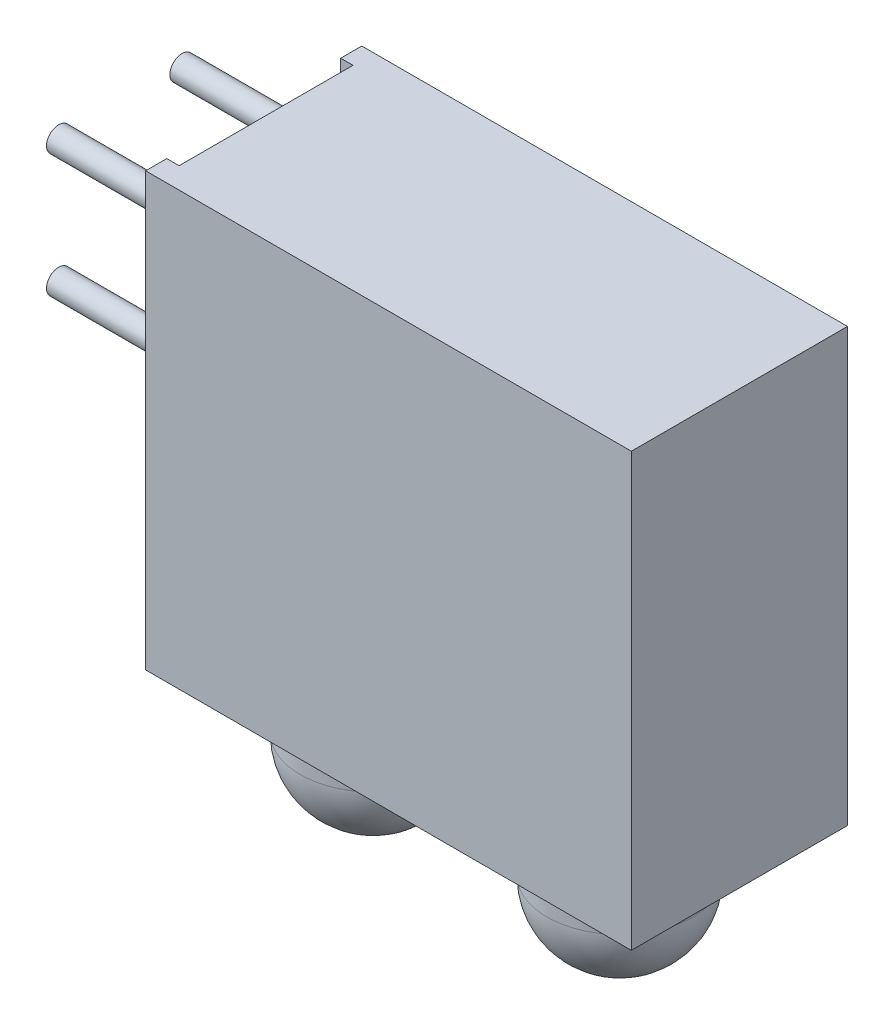
ISO-10303-21;
HEADER;
FILE_DESCRIPTION(('STEP AP214'),'2;1');
FILE_NAME('part.step','',(''),(''),'','','');
FILE_SCHEMA(('AUTOMOTIVE_DESIGN { 1 0 10303 214 1 1 1 1 }'));
ENDSEC;
DATA;
#1=APPLICATION_CONTEXT('core data for automotive mechanical design processes');
#2=APPLICATION_PROTOCOL_DEFINITION('international standard','automotive_design',2000,#1);
#3=PRODUCT_CONTEXT('',#1,'mechanical');
#4=PRODUCT('Part','Part','',(#3));
#5=PRODUCT_RELATED_PRODUCT_CATEGORY('part','',(#4));
#6=PRODUCT_DEFINITION_FORMATION('','',#4);
#7=PRODUCT_DEFINITION_CONTEXT('part definition',#1,'design');
#8=PRODUCT_DEFINITION('design','',#6,#7);
#9=PRODUCT_DEFINITION_SHAPE('','',#8);
#10=(LENGTH_UNIT() NAMED_UNIT(*) SI_UNIT(.MILLI.,.METRE.));
#11=(NAMED_UNIT(*) PLANE_ANGLE_UNIT() SI_UNIT($,.RADIAN.));
#12=(NAMED_UNIT(*) SI_UNIT($,.STERADIAN.) SOLID_ANGLE_UNIT());
#13=UNCERTAINTY_MEASURE_WITH_UNIT(LENGTH_MEASURE(1.E-05),#10,'distance_accuracy_value','');
#14=(GEOMETRIC_REPRESENTATION_CONTEXT(3) GLOBAL_UNCERTAINTY_ASSIGNED_CONTEXT((#13)) GLOBAL_UNIT_ASSIGNED_CONTEXT((#10,
#11,#12)) REPRESENTATION_CONTEXT('',''));
#15=CARTESIAN_POINT('',(0.,0.,0.));
#16=DIRECTION('',(0.,0.,1.));
#17=DIRECTION('',(1.,0.,0.));
#18=AXIS2_PLACEMENT_3D('',#15,#16,#17);
#19=CARTESIAN_POINT('',(0.,8.9,2.225));
#20=DIRECTION('',(1.,0.,0.));
#21=DIRECTION('',(0.,0.,-1.));
#22=AXIS2_PLACEMENT_3D('',#19,#20,#21);
#23=PLANE('',#22);
#24=DIRECTION('',(0.,0.,1.));
#25=VECTOR('',#24,1.);
#26=CARTESIAN_POINT('',(0.,8.9,2.225));
#27=LINE('',#26,#25);
#28=CARTESIAN_POINT('',(0.,8.9,1.79));
#29=VERTEX_POINT('',#28);
#30=CARTESIAN_POINT('',(0.,8.9,2.225));
#31=VERTEX_POINT('',#30);
#32=EDGE_CURVE('E93',#29,#31,#27,.T.);
#33=ORIENTED_EDGE('',*,*,#32,.F.);
#34=DIRECTION('',(0.,-1.,0.));
#35=VECTOR('',#34,1.);
#36=CARTESIAN_POINT('',(0.,8.901,1.79));
#37=LINE('',#36,#35);
#38=CARTESIAN_POINT('',(0.,0.,1.79));
#39=VERTEX_POINT('',#38);
#40=EDGE_CURVE('E122',#29,#39,#37,.T.);
#41=ORIENTED_EDGE('',*,*,#40,.T.);
#42=DIRECTION('',(0.,0.,1.));
#43=VECTOR('',#42,1.);
#44=CARTESIAN_POINT('',(0.,0.,2.225));
#45=LINE('',#44,#43);
#46=CARTESIAN_POINT('',(0.,0.,2.225));
#47=VERTEX_POINT('',#46);
#48=EDGE_CURVE('E155',#39,#47,#45,.T.);
#49=ORIENTED_EDGE('',*,*,#48,.T.);
#50=DIRECTION('',(0.,-1.,0.));
#51=VECTOR('',#50,1.);
#52=CARTESIAN_POINT('',(0.,8.9,2.225));
#53=LINE('',#52,#51);
#54=EDGE_CURVE('E172',#31,#47,#53,.T.);
#55=ORIENTED_EDGE('',*,*,#54,.F.);
#56=EDGE_LOOP('',(#33,#41,#49,#55));
#57=FACE_BOUND('',#56,.T.);
#58=ADVANCED_FACE('F40',(#57),#23,.F.);
#59=CARTESIAN_POINT('',(0.,0.,-2.225));
#60=VERTEX_POINT('',#59);
#61=CARTESIAN_POINT('',(0.,0.,-1.79));
#62=VERTEX_POINT('',#61);
#63=EDGE_CURVE('E130',#60,#62,#45,.T.);
#64=ORIENTED_EDGE('',*,*,#63,.T.);
#65=DIRECTION('',(0.,-1.,0.));
#66=VECTOR('',#65,1.);
#67=CARTESIAN_POINT('',(0.,8.901,-1.79));
#68=LINE('',#67,#66);
#69=CARTESIAN_POINT('',(0.,8.9,-1.79));
#70=VERTEX_POINT('',#69);
#71=EDGE_CURVE('E56',#70,#62,#68,.T.);
#72=ORIENTED_EDGE('',*,*,#71,.F.);
#73=CARTESIAN_POINT('',(0.,8.9,-2.225));
#74=VERTEX_POINT('',#73);
#75=EDGE_CURVE('E128',#74,#70,#27,.T.);
#76=ORIENTED_EDGE('',*,*,#75,.F.);
#77=DIRECTION('',(0.,-1.,0.));
#78=VECTOR('',#77,1.);
#79=CARTESIAN_POINT('',(0.,8.9,-2.225));
#80=LINE('',#79,#78);
#81=EDGE_CURVE('E151',#74,#60,#80,.T.);
#82=ORIENTED_EDGE('',*,*,#81,.T.);
#83=EDGE_LOOP('',(#64,#72,#76,#82));
#84=FACE_BOUND('',#83,.T.);
#85=ADVANCED_FACE('F127',(#84),#23,.F.);
#86=CARTESIAN_POINT('',(0.,8.9,2.225));
#87=DIRECTION('',(0.,0.,-1.));
#88=DIRECTION('',(-1.,0.,0.));
#89=AXIS2_PLACEMENT_3D('',#86,#87,#88);
#90=PLANE('',#89);
#91=DIRECTION('',(1.,0.,0.));
#92=VECTOR('',#91,1.);
#93=CARTESIAN_POINT('',(0.,0.,2.225));
#94=LINE('',#93,#92);
#95=CARTESIAN_POINT('',(10.,0.,2.225));
#96=VERTEX_POINT('',#95);
#97=EDGE_CURVE('E154',#47,#96,#94,.T.);
#98=ORIENTED_EDGE('',*,*,#97,.T.);
#99=DIRECTION('',(0.,-1.,0.));
#100=VECTOR('',#99,1.);
#101=CARTESIAN_POINT('',(10.,8.9,2.225));
#102=LINE('',#101,#100);
#103=CARTESIAN_POINT('',(10.,8.9,2.225));
#104=VERTEX_POINT('',#103);
#105=EDGE_CURVE('E168',#104,#96,#102,.T.);
#106=ORIENTED_EDGE('',*,*,#105,.F.);
#107=DIRECTION('',(1.,0.,0.));
#108=VECTOR('',#107,1.);
#109=CARTESIAN_POINT('',(0.,8.9,2.225));
#110=LINE('',#109,#108);
#111=EDGE_CURVE('E136',#31,#104,#110,.T.);
#112=ORIENTED_EDGE('',*,*,#111,.F.);
#113=ORIENTED_EDGE('',*,*,#54,.T.);
#114=EDGE_LOOP('',(#98,#106,#112,#113));
#115=FACE_BOUND('',#114,.T.);
#116=ADVANCED_FACE('F287',(#115),#90,.F.);
#117=CARTESIAN_POINT('',(10.,8.9,2.225));
#118=DIRECTION('',(-1.,0.,0.));
#119=DIRECTION('',(0.,0.,1.));
#120=AXIS2_PLACEMENT_3D('',#117,#118,#119);
#121=PLANE('',#120);
#122=DIRECTION('',(0.,0.,-1.));
#123=VECTOR('',#122,1.);
#124=CARTESIAN_POINT('',(10.,0.,2.225));
#125=LINE('',#124,#123);
#126=CARTESIAN_POINT('',(10.,0.,-2.225));
#127=VERTEX_POINT('',#126);
#128=EDGE_CURVE('E158',#96,#127,#125,.T.);
#129=ORIENTED_EDGE('',*,*,#128,.T.);
#130=DIRECTION('',(0.,-1.,0.));
#131=VECTOR('',#130,1.);
#132=CARTESIAN_POINT('',(10.,8.9,-2.225));
#133=LINE('',#132,#131);
#134=CARTESIAN_POINT('',(10.,8.9,-2.225));
#135=VERTEX_POINT('',#134);
#136=EDGE_CURVE('E165',#135,#127,#133,.T.);
#137=ORIENTED_EDGE('',*,*,#136,.F.);
#138=DIRECTION('',(0.,0.,-1.));
#139=VECTOR('',#138,1.);
#140=CARTESIAN_POINT('',(10.,8.9,2.225));
#141=LINE('',#140,#139);
#142=EDGE_CURVE('E140',#104,#135,#141,.T.);
#143=ORIENTED_EDGE('',*,*,#142,.F.);
#144=ORIENTED_EDGE('',*,*,#105,.T.);
#145=EDGE_LOOP('',(#129,#137,#143,#144));
#146=FACE_BOUND('',#145,.T.);
#147=ADVANCED_FACE('F310',(#146),#121,.F.);
#148=CARTESIAN_POINT('',(0.,8.9,-2.225));
#149=DIRECTION('',(0.,0.,1.));
#150=DIRECTION('',(1.,0.,0.));
#151=AXIS2_PLACEMENT_3D('',#148,#149,#150);
#152=PLANE('',#151);
#153=DIRECTION('',(-1.,0.,0.));
#154=VECTOR('',#153,1.);
#155=CARTESIAN_POINT('',(0.,0.,-2.225));
#156=LINE('',#155,#154);
#157=EDGE_CURVE('E86',#127,#60,#156,.T.);
#158=ORIENTED_EDGE('',*,*,#157,.T.);
#159=ORIENTED_EDGE('',*,*,#81,.F.);
#160=DIRECTION('',(-1.,0.,0.));
#161=VECTOR('',#160,1.);
#162=CARTESIAN_POINT('',(0.,8.9,-2.225));
#163=LINE('',#162,#161);
#164=EDGE_CURVE('E65',#135,#74,#163,.T.);
#165=ORIENTED_EDGE('',*,*,#164,.F.);
#166=ORIENTED_EDGE('',*,*,#136,.T.);
#167=EDGE_LOOP('',(#158,#159,#165,#166));
#168=FACE_BOUND('',#167,.T.);
#169=ADVANCED_FACE('F307',(#168),#152,.F.);
#170=CARTESIAN_POINT('',(0.,8.9,0.));
#171=DIRECTION('',(0.,-1.,0.));
#172=DIRECTION('',(0.,0.,-1.));
#173=AXIS2_PLACEMENT_3D('',#170,#171,#172);
#174=PLANE('',#173);
#175=DIRECTION('',(0.,0.,-1.));
#176=VECTOR('',#175,1.);
#177=CARTESIAN_POINT('',(0.254,8.9,1.79));
#178=LINE('',#177,#176);
#179=CARTESIAN_POINT('',(0.254,8.9,1.79));
#180=VERTEX_POINT('',#179);
#181=CARTESIAN_POINT('',(0.254,8.9,-1.79));
#182=VERTEX_POINT('',#181);
#183=EDGE_CURVE('E207',#180,#182,#178,.T.);
#184=ORIENTED_EDGE('',*,*,#183,.F.);
#185=DIRECTION('',(1.,0.,0.));
#186=VECTOR('',#185,1.);
#187=CARTESIAN_POINT('',(0.,8.9,1.79));
#188=LINE('',#187,#186);
#189=EDGE_CURVE('E211',#29,#180,#188,.T.);
#190=ORIENTED_EDGE('',*,*,#189,.F.);
#191=ORIENTED_EDGE('',*,*,#32,.T.);
#192=ORIENTED_EDGE('',*,*,#111,.T.);
#193=ORIENTED_EDGE('',*,*,#142,.T.);
#194=ORIENTED_EDGE('',*,*,#164,.T.);
#195=ORIENTED_EDGE('',*,*,#75,.T.);
#196=DIRECTION('',(-1.,0.,0.));
#197=VECTOR('',#196,1.);
#198=CARTESIAN_POINT('',(0.,8.9,-1.79));
#199=LINE('',#198,#197);
#200=EDGE_CURVE('E115',#182,#70,#199,.T.);
#201=ORIENTED_EDGE('',*,*,#200,.F.);
#202=EDGE_LOOP('',(#184,#190,#191,#192,#193,#194,#195,#201));
#203=FACE_BOUND('',#202,.T.);
#204=ADVANCED_FACE('F134',(#203),#174,.F.);
#205=CARTESIAN_POINT('',(0.,0.,0.));
#206=DIRECTION('',(0.,-1.,0.));
#207=DIRECTION('',(0.,0.,-1.));
#208=AXIS2_PLACEMENT_3D('',#205,#206,#207);
#209=PLANE('',#208);
#210=DIRECTION('',(-1.,0.,0.));
#211=VECTOR('',#210,1.);
#212=CARTESIAN_POINT('',(0.,0.,1.79));
#213=LINE('',#212,#211);
#214=CARTESIAN_POINT('',(0.254,0.,1.79));
#215=VERTEX_POINT('',#214);
#216=EDGE_CURVE('E132',#215,#39,#213,.T.);
#217=ORIENTED_EDGE('',*,*,#216,.F.);
#218=DIRECTION('',(0.,0.,1.));
#219=VECTOR('',#218,1.);
#220=CARTESIAN_POINT('',(0.254,0.,1.79));
#221=LINE('',#220,#219);
#222=CARTESIAN_POINT('',(0.254,0.,-1.79));
#223=VERTEX_POINT('',#222);
#224=EDGE_CURVE('E225',#223,#215,#221,.T.);
#225=ORIENTED_EDGE('',*,*,#224,.F.);
#226=DIRECTION('',(1.,0.,0.));
#227=VECTOR('',#226,1.);
#228=CARTESIAN_POINT('',(0.,0.,-1.79));
#229=LINE('',#228,#227);
#230=EDGE_CURVE('E216',#62,#223,#229,.T.);
#231=ORIENTED_EDGE('',*,*,#230,.F.);
#232=ORIENTED_EDGE('',*,*,#63,.F.);
#233=ORIENTED_EDGE('',*,*,#157,.F.);
#234=ORIENTED_EDGE('',*,*,#128,.F.);
#235=ORIENTED_EDGE('',*,*,#97,.F.);
#236=ORIENTED_EDGE('',*,*,#48,.F.);
#237=EDGE_LOOP('',(#217,#225,#231,#232,#233,#234,#235,#236));
#238=FACE_BOUND('',#237,.T.);
#239=CARTESIAN_POINT('',(2.46,0.,0.));
#240=DIRECTION('',(0.,-1.,0.));
#241=DIRECTION('',(0.,0.,-1.));
#242=AXIS2_PLACEMENT_3D('',#239,#240,#241);
#243=CIRCLE('',#242,1.5);
#244=CARTESIAN_POINT('',(2.46,0.,-1.5));
#245=VERTEX_POINT('',#244);
#246=EDGE_CURVE('E121',#245,#245,#243,.T.);
#247=ORIENTED_EDGE('',*,*,#246,.F.);
#248=EDGE_LOOP('',(#247));
#249=FACE_BOUND('',#248,.T.);
#250=CARTESIAN_POINT('',(7.54,0.,0.));
#251=DIRECTION('',(0.,-1.,0.));
#252=DIRECTION('',(0.,0.,-1.));
#253=AXIS2_PLACEMENT_3D('',#250,#251,#252);
#254=CIRCLE('',#253,1.5);
#255=CARTESIAN_POINT('',(7.54,0.,-1.5));
#256=VERTEX_POINT('',#255);
#257=EDGE_CURVE('E144',#256,#256,#254,.T.);
#258=ORIENTED_EDGE('',*,*,#257,.F.);
#259=EDGE_LOOP('',(#258));
#260=FACE_BOUND('',#259,.T.);
#261=ADVANCED_FACE('F242',(#238,#249,#260),#209,.T.);
#262=CARTESIAN_POINT('',(7.54,-1.,0.));
#263=DIRECTION('',(0.,1.,0.));
#264=DIRECTION('',(0.,0.,1.));
#265=AXIS2_PLACEMENT_3D('',#262,#263,#264);
#266=CYLINDRICAL_SURFACE('',#265,1.5);
#267=CARTESIAN_POINT('',(7.54,-1.,0.));
#268=DIRECTION('',(0.,-1.,0.));
#269=DIRECTION('',(0.,0.,-1.));
#270=AXIS2_PLACEMENT_3D('',#267,#268,#269);
#271=CIRCLE('',#270,1.5);
#272=CARTESIAN_POINT('',(7.54,-1.,-1.5));
#273=VERTEX_POINT('',#272);
#274=EDGE_CURVE('E177',#273,#273,#271,.T.);
#275=ORIENTED_EDGE('',*,*,#274,.F.);
#276=EDGE_LOOP('',(#275));
#277=FACE_BOUND('',#276,.T.);
#278=ORIENTED_EDGE('',*,*,#257,.T.);
#279=EDGE_LOOP('',(#278));
#280=FACE_BOUND('',#279,.T.);
#281=ADVANCED_FACE('F245',(#277,#280),#266,.T.);
#282=CARTESIAN_POINT('',(7.54,-1.,0.));
#283=DIRECTION('',(0.,0.,1.));
#284=DIRECTION('',(1.,0.,0.));
#285=AXIS2_PLACEMENT_3D('',#282,#283,#284);
#286=SPHERICAL_SURFACE('',#285,1.5);
#287=CARTESIAN_POINT('',(7.54,-1.,0.));
#288=DIRECTION('',(0.,-1.,0.));
#289=DIRECTION('',(0.,0.,-1.));
#290=AXIS2_PLACEMENT_3D('',#287,#288,#289);
#291=SPHERICAL_SURFACE('',#290,1.5);
#292=ORIENTED_EDGE('',*,*,#274,.T.);
#293=EDGE_LOOP('',(#292));
#294=FACE_BOUND('',#293,.T.);
#295=ADVANCED_FACE('F290',(#294),#291,.T.);
#296=CARTESIAN_POINT('',(2.46,-1.,0.));
#297=DIRECTION('',(0.,1.,0.));
#298=DIRECTION('',(0.,0.,1.));
#299=AXIS2_PLACEMENT_3D('',#296,#297,#298);
#300=CYLINDRICAL_SURFACE('',#299,1.5);
#301=CARTESIAN_POINT('',(2.46,-1.,0.));
#302=DIRECTION('',(0.,-1.,0.));
#303=DIRECTION('',(0.,0.,-1.));
#304=AXIS2_PLACEMENT_3D('',#301,#302,#303);
#305=CIRCLE('',#304,1.5);
#306=CARTESIAN_POINT('',(2.46,-1.,-1.5));
#307=VERTEX_POINT('',#306);
#308=EDGE_CURVE('E181',#307,#307,#305,.T.);
#309=ORIENTED_EDGE('',*,*,#308,.F.);
#310=EDGE_LOOP('',(#309));
#311=FACE_BOUND('',#310,.T.);
#312=ORIENTED_EDGE('',*,*,#246,.T.);
#313=EDGE_LOOP('',(#312));
#314=FACE_BOUND('',#313,.T.);
#315=ADVANCED_FACE('F240',(#311,#314),#300,.T.);
#316=CARTESIAN_POINT('',(2.46,-1.,0.));
#317=DIRECTION('',(0.,0.,1.));
#318=DIRECTION('',(1.,0.,0.));
#319=AXIS2_PLACEMENT_3D('',#316,#317,#318);
#320=SPHERICAL_SURFACE('',#319,1.5);
#321=CARTESIAN_POINT('',(2.46,-1.,0.));
#322=DIRECTION('',(0.,-1.,0.));
#323=DIRECTION('',(0.,0.,-1.));
#324=AXIS2_PLACEMENT_3D('',#321,#322,#323);
#325=SPHERICAL_SURFACE('',#324,1.5);
#326=ORIENTED_EDGE('',*,*,#308,.T.);
#327=EDGE_LOOP('',(#326));
#328=FACE_BOUND('',#327,.T.);
#329=ADVANCED_FACE('F42',(#328),#325,.T.);
#330=CARTESIAN_POINT('',(0.,8.901,1.79));
#331=DIRECTION('',(0.,0.,1.));
#332=DIRECTION('',(1.,0.,0.));
#333=AXIS2_PLACEMENT_3D('',#330,#331,#332);
#334=PLANE('',#333);
#335=ORIENTED_EDGE('',*,*,#189,.T.);
#336=DIRECTION('',(0.,-1.,0.));
#337=VECTOR('',#336,1.);
#338=CARTESIAN_POINT('',(0.254,8.901,1.79));
#339=LINE('',#338,#337);
#340=EDGE_CURVE('E209',#180,#215,#339,.T.);
#341=ORIENTED_EDGE('',*,*,#340,.T.);
#342=ORIENTED_EDGE('',*,*,#216,.T.);
#343=ORIENTED_EDGE('',*,*,#40,.F.);
#344=EDGE_LOOP('',(#335,#341,#342,#343));
#345=FACE_BOUND('',#344,.T.);
#346=ADVANCED_FACE('F200',(#345),#334,.F.);
#347=CARTESIAN_POINT('',(0.254,8.901,1.79));
#348=DIRECTION('',(1.,0.,0.));
#349=DIRECTION('',(0.,0.,-1.));
#350=AXIS2_PLACEMENT_3D('',#347,#348,#349);
#351=PLANE('',#350);
#352=CARTESIAN_POINT('',(0.254,5.08,1.27));
#353=DIRECTION('',(1.,0.,0.));
#354=DIRECTION('',(0.,0.,-1.));
#355=AXIS2_PLACEMENT_3D('',#352,#353,#354);
#356=CIRCLE('',#355,0.25);
#357=CARTESIAN_POINT('',(0.254,5.08,1.02));
#358=VERTEX_POINT('',#357);
#359=EDGE_CURVE('E11',#358,#358,#356,.F.);
#360=ORIENTED_EDGE('',*,*,#359,.F.);
#361=EDGE_LOOP('',(#360));
#362=FACE_BOUND('',#361,.T.);
#363=CARTESIAN_POINT('',(0.254,7.62,1.27));
#364=DIRECTION('',(1.,0.,0.));
#365=DIRECTION('',(0.,0.,-1.));
#366=AXIS2_PLACEMENT_3D('',#363,#364,#365);
#367=CIRCLE('',#366,0.25);
#368=CARTESIAN_POINT('',(0.254,7.62,1.02));
#369=VERTEX_POINT('',#368);
#370=EDGE_CURVE('E49',#369,#369,#367,.F.);
#371=ORIENTED_EDGE('',*,*,#370,.F.);
#372=EDGE_LOOP('',(#371));
#373=FACE_BOUND('',#372,.T.);
#374=CARTESIAN_POINT('',(0.254,7.62,-1.27));
#375=DIRECTION('',(1.,0.,0.));
#376=DIRECTION('',(0.,0.,-1.));
#377=AXIS2_PLACEMENT_3D('',#374,#375,#376);
#378=CIRCLE('',#377,0.25);
#379=CARTESIAN_POINT('',(0.254,7.62,-1.52));
#380=VERTEX_POINT('',#379);
#381=EDGE_CURVE('E188',#380,#380,#378,.F.);
#382=ORIENTED_EDGE('',*,*,#381,.F.);
#383=EDGE_LOOP('',(#382));
#384=FACE_BOUND('',#383,.T.);
#385=CARTESIAN_POINT('',(0.254,5.08,-1.27));
#386=DIRECTION('',(1.,0.,0.));
#387=DIRECTION('',(0.,0.,-1.));
#388=AXIS2_PLACEMENT_3D('',#385,#386,#387);
#389=CIRCLE('',#388,0.25);
#390=CARTESIAN_POINT('',(0.254,5.08,-1.52));
#391=VERTEX_POINT('',#390);
#392=EDGE_CURVE('E176',#391,#391,#389,.F.);
#393=ORIENTED_EDGE('',*,*,#392,.F.);
#394=EDGE_LOOP('',(#393));
#395=FACE_BOUND('',#394,.T.);
#396=ORIENTED_EDGE('',*,*,#183,.T.);
#397=DIRECTION('',(0.,-1.,0.));
#398=VECTOR('',#397,1.);
#399=CARTESIAN_POINT('',(0.254,8.901,-1.79));
#400=LINE('',#399,#398);
#401=EDGE_CURVE('E117',#182,#223,#400,.T.);
#402=ORIENTED_EDGE('',*,*,#401,.T.);
#403=ORIENTED_EDGE('',*,*,#224,.T.);
#404=ORIENTED_EDGE('',*,*,#340,.F.);
#405=EDGE_LOOP('',(#396,#402,#403,#404));
#406=FACE_BOUND('',#405,.T.);
#407=ADVANCED_FACE('F197',(#362,#373,#384,#395,#406),#351,.F.);
#408=CARTESIAN_POINT('',(0.,8.901,-1.79));
#409=DIRECTION('',(0.,0.,-1.));
#410=DIRECTION('',(-1.,0.,0.));
#411=AXIS2_PLACEMENT_3D('',#408,#409,#410);
#412=PLANE('',#411);
#413=ORIENTED_EDGE('',*,*,#200,.T.);
#414=ORIENTED_EDGE('',*,*,#71,.T.);
#415=ORIENTED_EDGE('',*,*,#230,.T.);
#416=ORIENTED_EDGE('',*,*,#401,.F.);
#417=EDGE_LOOP('',(#413,#414,#415,#416));
#418=FACE_BOUND('',#417,.T.);
#419=ADVANCED_FACE('F116',(#418),#412,.F.);
#420=CARTESIAN_POINT('',(-2.746,5.08,-1.27));
#421=DIRECTION('',(1.,0.,0.));
#422=DIRECTION('',(0.,0.,-1.));
#423=AXIS2_PLACEMENT_3D('',#420,#421,#422);
#424=CYLINDRICAL_SURFACE('',#423,0.25);
#425=CARTESIAN_POINT('',(-2.746,5.08,-1.27));
#426=DIRECTION('',(-1.,0.,0.));
#427=DIRECTION('',(0.,0.,1.));
#428=AXIS2_PLACEMENT_3D('',#425,#426,#427);
#429=CIRCLE('',#428,0.25);
#430=CARTESIAN_POINT('',(-2.746,5.08,-1.02));
#431=VERTEX_POINT('',#430);
#432=EDGE_CURVE('E212',#431,#431,#429,.T.);
#433=ORIENTED_EDGE('',*,*,#432,.F.);
#434=EDGE_LOOP('',(#433));
#435=FACE_BOUND('',#434,.T.);
#436=ORIENTED_EDGE('',*,*,#392,.T.);
#437=EDGE_LOOP('',(#436));
#438=FACE_BOUND('',#437,.T.);
#439=ADVANCED_FACE('F278',(#435,#438),#424,.T.);
#440=CARTESIAN_POINT('',(-2.746,5.08,-1.27));
#441=DIRECTION('',(-1.,0.,0.));
#442=DIRECTION('',(0.,0.,1.));
#443=AXIS2_PLACEMENT_3D('',#440,#441,#442);
#444=PLANE('',#443);
#445=ORIENTED_EDGE('',*,*,#432,.T.);
#446=EDGE_LOOP('',(#445));
#447=FACE_BOUND('',#446,.T.);
#448=ADVANCED_FACE('F271',(#447),#444,.T.);
#449=CARTESIAN_POINT('',(-2.746,7.62,-1.27));
#450=DIRECTION('',(1.,0.,0.));
#451=DIRECTION('',(0.,0.,-1.));
#452=AXIS2_PLACEMENT_3D('',#449,#450,#451);
#453=CYLINDRICAL_SURFACE('',#452,0.25);
#454=CARTESIAN_POINT('',(-2.746,7.62,-1.27));
#455=DIRECTION('',(-1.,0.,0.));
#456=DIRECTION('',(0.,0.,1.));
#457=AXIS2_PLACEMENT_3D('',#454,#455,#456);
#458=CIRCLE('',#457,0.25);
#459=CARTESIAN_POINT('',(-2.746,7.62,-1.02));
#460=VERTEX_POINT('',#459);
#461=EDGE_CURVE('E219',#460,#460,#458,.T.);
#462=ORIENTED_EDGE('',*,*,#461,.F.);
#463=EDGE_LOOP('',(#462));
#464=FACE_BOUND('',#463,.T.);
#465=ORIENTED_EDGE('',*,*,#381,.T.);
#466=EDGE_LOOP('',(#465));
#467=FACE_BOUND('',#466,.T.);
#468=ADVANCED_FACE('F268',(#464,#467),#453,.T.);
#469=CARTESIAN_POINT('',(-2.746,7.62,-1.27));
#470=DIRECTION('',(-1.,0.,0.));
#471=DIRECTION('',(0.,0.,1.));
#472=AXIS2_PLACEMENT_3D('',#469,#470,#471);
#473=PLANE('',#472);
#474=ORIENTED_EDGE('',*,*,#461,.T.);
#475=EDGE_LOOP('',(#474));
#476=FACE_BOUND('',#475,.T.);
#477=ADVANCED_FACE('F266',(#476),#473,.T.);
#478=CARTESIAN_POINT('',(-2.746,7.62,1.27));
#479=DIRECTION('',(1.,0.,0.));
#480=DIRECTION('',(0.,0.,-1.));
#481=AXIS2_PLACEMENT_3D('',#478,#479,#480);
#482=CYLINDRICAL_SURFACE('',#481,0.25);
#483=CARTESIAN_POINT('',(-2.746,7.62,1.27));
#484=DIRECTION('',(-1.,0.,0.));
#485=DIRECTION('',(0.,0.,-1.));
#486=AXIS2_PLACEMENT_3D('',#483,#484,#485);
#487=CIRCLE('',#486,0.25);
#488=CARTESIAN_POINT('',(-2.746,7.62,1.02));
#489=VERTEX_POINT('',#488);
#490=EDGE_CURVE('E256',#489,#489,#487,.T.);
#491=ORIENTED_EDGE('',*,*,#490,.F.);
#492=EDGE_LOOP('',(#491));
#493=FACE_BOUND('',#492,.T.);
#494=ORIENTED_EDGE('',*,*,#370,.T.);
#495=EDGE_LOOP('',(#494));
#496=FACE_BOUND('',#495,.T.);
#497=ADVANCED_FACE('F195',(#493,#496),#482,.T.);
#498=CARTESIAN_POINT('',(-2.746,7.62,1.27));
#499=DIRECTION('',(1.,0.,0.));
#500=DIRECTION('',(0.,0.,-1.));
#501=AXIS2_PLACEMENT_3D('',#498,#499,#500);
#502=PLANE('',#501);
#503=ORIENTED_EDGE('',*,*,#490,.T.);
#504=EDGE_LOOP('',(#503));
#505=FACE_BOUND('',#504,.T.);
#506=ADVANCED_FACE('F362',(#505),#502,.F.);
#507=CARTESIAN_POINT('',(-2.746,5.08,1.27));
#508=DIRECTION('',(1.,0.,0.));
#509=DIRECTION('',(0.,0.,-1.));
#510=AXIS2_PLACEMENT_3D('',#507,#508,#509);
#511=CYLINDRICAL_SURFACE('',#510,0.25);
#512=CARTESIAN_POINT('',(-2.746,5.08,1.27));
#513=DIRECTION('',(-1.,0.,0.));
#514=DIRECTION('',(0.,0.,-1.));
#515=AXIS2_PLACEMENT_3D('',#512,#513,#514);
#516=CIRCLE('',#515,0.25);
#517=CARTESIAN_POINT('',(-2.746,5.08,1.02));
#518=VERTEX_POINT('',#517);
#519=EDGE_CURVE('E254',#518,#518,#516,.T.);
#520=ORIENTED_EDGE('',*,*,#519,.F.);
#521=EDGE_LOOP('',(#520));
#522=FACE_BOUND('',#521,.T.);
#523=ORIENTED_EDGE('',*,*,#359,.T.);
#524=EDGE_LOOP('',(#523));
#525=FACE_BOUND('',#524,.T.);
#526=ADVANCED_FACE('F371',(#522,#525),#511,.T.);
#527=CARTESIAN_POINT('',(-2.746,5.08,1.27));
#528=DIRECTION('',(1.,0.,0.));
#529=DIRECTION('',(0.,0.,-1.));
#530=AXIS2_PLACEMENT_3D('',#527,#528,#529);
#531=PLANE('',#530);
#532=ORIENTED_EDGE('',*,*,#519,.T.);
#533=EDGE_LOOP('',(#532));
#534=FACE_BOUND('',#533,.T.);
#535=ADVANCED_FACE('F380',(#534),#531,.F.);
#536=CLOSED_SHELL('',(#58,#85,#116,#147,#169,#204,#261,#281,#295,#315,#329,#346,#407,#419,#439,
#448,#468,#477,#497,#506,#526,#535));
#537=MANIFOLD_SOLID_BREP('B2',#536);
#538=ADVANCED_BREP_SHAPE_REPRESENTATION('',(#18,#537),#14);
#539=SHAPE_DEFINITION_REPRESENTATION(#9,#538);
ENDSEC;
END-ISO-10303-21;
